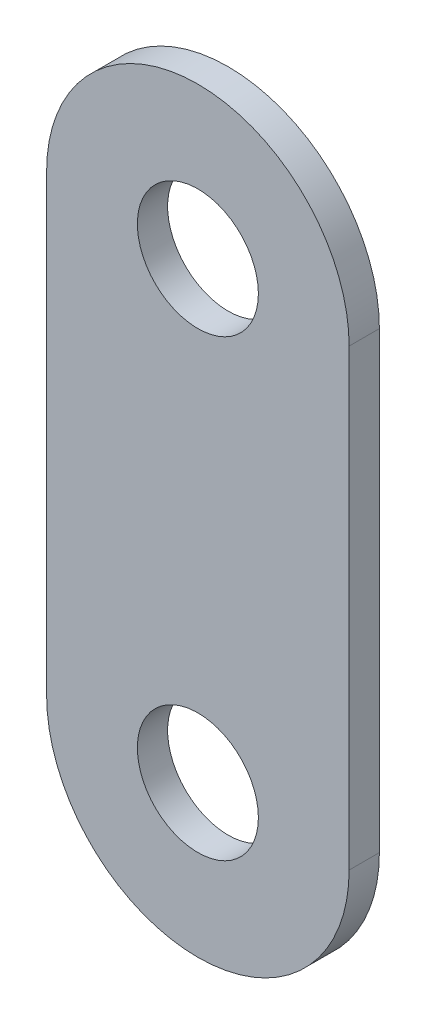
ISO-10303-21;
HEADER;
FILE_DESCRIPTION(('STEP AP214'),'2;1');
FILE_NAME('part.step','',(''),(''),'','','');
FILE_SCHEMA(('AUTOMOTIVE_DESIGN { 1 0 10303 214 1 1 1 1 }'));
ENDSEC;
DATA;
#1=APPLICATION_CONTEXT('core data for automotive mechanical design processes');
#2=APPLICATION_PROTOCOL_DEFINITION('international standard','automotive_design',2000,#1);
#3=PRODUCT_CONTEXT('',#1,'mechanical');
#4=PRODUCT('Part','Part','',(#3));
#5=PRODUCT_RELATED_PRODUCT_CATEGORY('part','',(#4));
#6=PRODUCT_DEFINITION_FORMATION('','',#4);
#7=PRODUCT_DEFINITION_CONTEXT('part definition',#1,'design');
#8=PRODUCT_DEFINITION('design','',#6,#7);
#9=PRODUCT_DEFINITION_SHAPE('','',#8);
#10=(LENGTH_UNIT() NAMED_UNIT(*) SI_UNIT(.MILLI.,.METRE.));
#11=(NAMED_UNIT(*) PLANE_ANGLE_UNIT() SI_UNIT($,.RADIAN.));
#12=(NAMED_UNIT(*) SI_UNIT($,.STERADIAN.) SOLID_ANGLE_UNIT());
#13=UNCERTAINTY_MEASURE_WITH_UNIT(LENGTH_MEASURE(1.E-05),#10,'distance_accuracy_value','');
#14=(GEOMETRIC_REPRESENTATION_CONTEXT(3) GLOBAL_UNCERTAINTY_ASSIGNED_CONTEXT((#13)) GLOBAL_UNIT_ASSIGNED_CONTEXT((#10,
#11,#12)) REPRESENTATION_CONTEXT('',''));
#15=CARTESIAN_POINT('',(0.,0.,0.));
#16=DIRECTION('',(0.,0.,1.));
#17=DIRECTION('',(1.,0.,0.));
#18=AXIS2_PLACEMENT_3D('',#15,#16,#17);
#19=CARTESIAN_POINT('',(25.,125.,5.));
#20=DIRECTION('',(0.,0.,-1.));
#21=DIRECTION('',(-1.,0.,0.));
#22=AXIS2_PLACEMENT_3D('',#19,#20,#21);
#23=PLANE('',#22);
#24=CARTESIAN_POINT('',(25.,125.,5.));
#25=DIRECTION('',(0.,0.,1.));
#26=DIRECTION('',(-1.,0.,0.));
#27=AXIS2_PLACEMENT_3D('',#24,#25,#26);
#28=CIRCLE('',#27,25.);
#29=CARTESIAN_POINT('',(50.,125.,5.));
#30=VERTEX_POINT('',#29);
#31=CARTESIAN_POINT('',(0.,125.,5.));
#32=VERTEX_POINT('',#31);
#33=EDGE_CURVE('E91',#30,#32,#28,.T.);
#34=ORIENTED_EDGE('',*,*,#33,.T.);
#35=DIRECTION('',(0.,-1.,0.));
#36=VECTOR('',#35,1.);
#37=CARTESIAN_POINT('',(0.,50.,5.));
#38=LINE('',#37,#36);
#39=CARTESIAN_POINT('',(0.,50.,5.));
#40=VERTEX_POINT('',#39);
#41=EDGE_CURVE('E86',#32,#40,#38,.T.);
#42=ORIENTED_EDGE('',*,*,#41,.T.);
#43=CARTESIAN_POINT('',(25.,50.,5.));
#44=DIRECTION('',(0.,0.,1.));
#45=DIRECTION('',(1.,0.,0.));
#46=AXIS2_PLACEMENT_3D('',#43,#44,#45);
#47=CIRCLE('',#46,25.);
#48=CARTESIAN_POINT('',(50.,50.,5.));
#49=VERTEX_POINT('',#48);
#50=EDGE_CURVE('E89',#40,#49,#47,.T.);
#51=ORIENTED_EDGE('',*,*,#50,.T.);
#52=DIRECTION('',(0.,1.,0.));
#53=VECTOR('',#52,1.);
#54=CARTESIAN_POINT('',(50.,50.,5.));
#55=LINE('',#54,#53);
#56=EDGE_CURVE('E56',#49,#30,#55,.T.);
#57=ORIENTED_EDGE('',*,*,#56,.T.);
#58=EDGE_LOOP('',(#34,#42,#51,#57));
#59=FACE_BOUND('',#58,.T.);
#60=CARTESIAN_POINT('',(25.,50.,5.));
#61=DIRECTION('',(0.,0.,1.));
#62=DIRECTION('',(1.,0.,0.));
#63=AXIS2_PLACEMENT_3D('',#60,#61,#62);
#64=CIRCLE('',#63,10.);
#65=CARTESIAN_POINT('',(35.,50.,5.));
#66=VERTEX_POINT('',#65);
#67=EDGE_CURVE('E106',#66,#66,#64,.T.);
#68=ORIENTED_EDGE('',*,*,#67,.F.);
#69=EDGE_LOOP('',(#68));
#70=FACE_BOUND('',#69,.T.);
#71=CARTESIAN_POINT('',(25.,125.,5.));
#72=DIRECTION('',(0.,0.,1.));
#73=DIRECTION('',(1.,0.,0.));
#74=AXIS2_PLACEMENT_3D('',#71,#72,#73);
#75=CIRCLE('',#74,10.);
#76=CARTESIAN_POINT('',(35.,125.,5.));
#77=VERTEX_POINT('',#76);
#78=EDGE_CURVE('E121',#77,#77,#75,.T.);
#79=ORIENTED_EDGE('',*,*,#78,.F.);
#80=EDGE_LOOP('',(#79));
#81=FACE_BOUND('',#80,.T.);
#82=ADVANCED_FACE('F39',(#59,#70,#81),#23,.F.);
#83=CARTESIAN_POINT('',(25.,125.,0.));
#84=DIRECTION('',(0.,0.,-1.));
#85=DIRECTION('',(-1.,0.,0.));
#86=AXIS2_PLACEMENT_3D('',#83,#84,#85);
#87=PLANE('',#86);
#88=CARTESIAN_POINT('',(25.,50.,0.));
#89=DIRECTION('',(0.,0.,1.));
#90=DIRECTION('',(1.,0.,0.));
#91=AXIS2_PLACEMENT_3D('',#88,#89,#90);
#92=CIRCLE('',#91,10.);
#93=CARTESIAN_POINT('',(35.,50.,0.));
#94=VERTEX_POINT('',#93);
#95=EDGE_CURVE('E117',#94,#94,#92,.T.);
#96=ORIENTED_EDGE('',*,*,#95,.T.);
#97=EDGE_LOOP('',(#96));
#98=FACE_BOUND('',#97,.T.);
#99=CARTESIAN_POINT('',(25.,125.,0.));
#100=DIRECTION('',(0.,0.,1.));
#101=DIRECTION('',(-1.,0.,0.));
#102=AXIS2_PLACEMENT_3D('',#99,#100,#101);
#103=CIRCLE('',#102,25.);
#104=CARTESIAN_POINT('',(50.,125.,0.));
#105=VERTEX_POINT('',#104);
#106=CARTESIAN_POINT('',(0.,125.,0.));
#107=VERTEX_POINT('',#106);
#108=EDGE_CURVE('E103',#105,#107,#103,.T.);
#109=ORIENTED_EDGE('',*,*,#108,.F.);
#110=DIRECTION('',(0.,1.,0.));
#111=VECTOR('',#110,1.);
#112=CARTESIAN_POINT('',(50.,50.,0.));
#113=LINE('',#112,#111);
#114=CARTESIAN_POINT('',(50.,50.,0.));
#115=VERTEX_POINT('',#114);
#116=EDGE_CURVE('E79',#115,#105,#113,.T.);
#117=ORIENTED_EDGE('',*,*,#116,.F.);
#118=CARTESIAN_POINT('',(25.,50.,0.));
#119=DIRECTION('',(0.,0.,1.));
#120=DIRECTION('',(1.,0.,0.));
#121=AXIS2_PLACEMENT_3D('',#118,#119,#120);
#122=CIRCLE('',#121,25.);
#123=CARTESIAN_POINT('',(0.,50.,0.));
#124=VERTEX_POINT('',#123);
#125=EDGE_CURVE('E73',#124,#115,#122,.T.);
#126=ORIENTED_EDGE('',*,*,#125,.F.);
#127=DIRECTION('',(0.,-1.,0.));
#128=VECTOR('',#127,1.);
#129=CARTESIAN_POINT('',(0.,50.,0.));
#130=LINE('',#129,#128);
#131=EDGE_CURVE('E95',#107,#124,#130,.T.);
#132=ORIENTED_EDGE('',*,*,#131,.F.);
#133=EDGE_LOOP('',(#109,#117,#126,#132));
#134=FACE_BOUND('',#133,.T.);
#135=CARTESIAN_POINT('',(25.,125.,0.));
#136=DIRECTION('',(0.,0.,1.));
#137=DIRECTION('',(1.,0.,0.));
#138=AXIS2_PLACEMENT_3D('',#135,#136,#137);
#139=CIRCLE('',#138,10.);
#140=CARTESIAN_POINT('',(35.,125.,0.));
#141=VERTEX_POINT('',#140);
#142=EDGE_CURVE('E128',#141,#141,#139,.T.);
#143=ORIENTED_EDGE('',*,*,#142,.T.);
#144=EDGE_LOOP('',(#143));
#145=FACE_BOUND('',#144,.T.);
#146=ADVANCED_FACE('F114',(#98,#134,#145),#87,.T.);
#147=CARTESIAN_POINT('',(25.,125.,5.));
#148=DIRECTION('',(0.,0.,-1.));
#149=DIRECTION('',(-1.,0.,0.));
#150=AXIS2_PLACEMENT_3D('',#147,#148,#149);
#151=CYLINDRICAL_SURFACE('',#150,25.);
#152=ORIENTED_EDGE('',*,*,#108,.T.);
#153=DIRECTION('',(0.,0.,-1.));
#154=VECTOR('',#153,1.);
#155=CARTESIAN_POINT('',(0.,125.,5.));
#156=LINE('',#155,#154);
#157=EDGE_CURVE('E12',#32,#107,#156,.T.);
#158=ORIENTED_EDGE('',*,*,#157,.F.);
#159=ORIENTED_EDGE('',*,*,#33,.F.);
#160=DIRECTION('',(0.,0.,-1.));
#161=VECTOR('',#160,1.);
#162=CARTESIAN_POINT('',(50.,125.,5.));
#163=LINE('',#162,#161);
#164=EDGE_CURVE('E99',#30,#105,#163,.T.);
#165=ORIENTED_EDGE('',*,*,#164,.T.);
#166=EDGE_LOOP('',(#152,#158,#159,#165));
#167=FACE_BOUND('',#166,.T.);
#168=ADVANCED_FACE('F41',(#167),#151,.T.);
#169=CARTESIAN_POINT('',(0.,50.,5.));
#170=DIRECTION('',(1.,0.,0.));
#171=DIRECTION('',(0.,1.,0.));
#172=AXIS2_PLACEMENT_3D('',#169,#170,#171);
#173=PLANE('',#172);
#174=ORIENTED_EDGE('',*,*,#131,.T.);
#175=DIRECTION('',(0.,0.,-1.));
#176=VECTOR('',#175,1.);
#177=CARTESIAN_POINT('',(0.,50.,5.));
#178=LINE('',#177,#176);
#179=EDGE_CURVE('E48',#40,#124,#178,.T.);
#180=ORIENTED_EDGE('',*,*,#179,.F.);
#181=ORIENTED_EDGE('',*,*,#41,.F.);
#182=ORIENTED_EDGE('',*,*,#157,.T.);
#183=EDGE_LOOP('',(#174,#180,#181,#182));
#184=FACE_BOUND('',#183,.T.);
#185=ADVANCED_FACE('F94',(#184),#173,.F.);
#186=CARTESIAN_POINT('',(25.,50.,5.));
#187=DIRECTION('',(0.,0.,-1.));
#188=DIRECTION('',(-1.,0.,0.));
#189=AXIS2_PLACEMENT_3D('',#186,#187,#188);
#190=CYLINDRICAL_SURFACE('',#189,25.);
#191=ORIENTED_EDGE('',*,*,#125,.T.);
#192=DIRECTION('',(0.,0.,-1.));
#193=VECTOR('',#192,1.);
#194=CARTESIAN_POINT('',(50.,50.,5.));
#195=LINE('',#194,#193);
#196=EDGE_CURVE('E96',#49,#115,#195,.T.);
#197=ORIENTED_EDGE('',*,*,#196,.F.);
#198=ORIENTED_EDGE('',*,*,#50,.F.);
#199=ORIENTED_EDGE('',*,*,#179,.T.);
#200=EDGE_LOOP('',(#191,#197,#198,#199));
#201=FACE_BOUND('',#200,.T.);
#202=ADVANCED_FACE('F97',(#201),#190,.T.);
#203=CARTESIAN_POINT('',(50.,50.,5.));
#204=DIRECTION('',(-1.,0.,0.));
#205=DIRECTION('',(0.,-1.,0.));
#206=AXIS2_PLACEMENT_3D('',#203,#204,#205);
#207=PLANE('',#206);
#208=ORIENTED_EDGE('',*,*,#116,.T.);
#209=ORIENTED_EDGE('',*,*,#164,.F.);
#210=ORIENTED_EDGE('',*,*,#56,.F.);
#211=ORIENTED_EDGE('',*,*,#196,.T.);
#212=EDGE_LOOP('',(#208,#209,#210,#211));
#213=FACE_BOUND('',#212,.T.);
#214=ADVANCED_FACE('F111',(#213),#207,.F.);
#215=CARTESIAN_POINT('',(25.,50.,5.));
#216=DIRECTION('',(0.,0.,-1.));
#217=DIRECTION('',(-1.,0.,0.));
#218=AXIS2_PLACEMENT_3D('',#215,#216,#217);
#219=CYLINDRICAL_SURFACE('',#218,10.);
#220=ORIENTED_EDGE('',*,*,#67,.T.);
#221=EDGE_LOOP('',(#220));
#222=FACE_BOUND('',#221,.T.);
#223=ORIENTED_EDGE('',*,*,#95,.F.);
#224=EDGE_LOOP('',(#223));
#225=FACE_BOUND('',#224,.T.);
#226=ADVANCED_FACE('F146',(#222,#225),#219,.F.);
#227=CARTESIAN_POINT('',(25.,125.,5.));
#228=DIRECTION('',(0.,0.,-1.));
#229=DIRECTION('',(-1.,0.,0.));
#230=AXIS2_PLACEMENT_3D('',#227,#228,#229);
#231=CYLINDRICAL_SURFACE('',#230,10.);
#232=ORIENTED_EDGE('',*,*,#78,.T.);
#233=EDGE_LOOP('',(#232));
#234=FACE_BOUND('',#233,.T.);
#235=ORIENTED_EDGE('',*,*,#142,.F.);
#236=EDGE_LOOP('',(#235));
#237=FACE_BOUND('',#236,.T.);
#238=ADVANCED_FACE('F135',(#234,#237),#231,.F.);
#239=CLOSED_SHELL('',(#82,#146,#168,#185,#202,#214,#226,#238));
#240=MANIFOLD_SOLID_BREP('B2',#239);
#241=ADVANCED_BREP_SHAPE_REPRESENTATION('',(#18,#240),#14);
#242=SHAPE_DEFINITION_REPRESENTATION(#9,#241);
ENDSEC;
END-ISO-10303-21;
